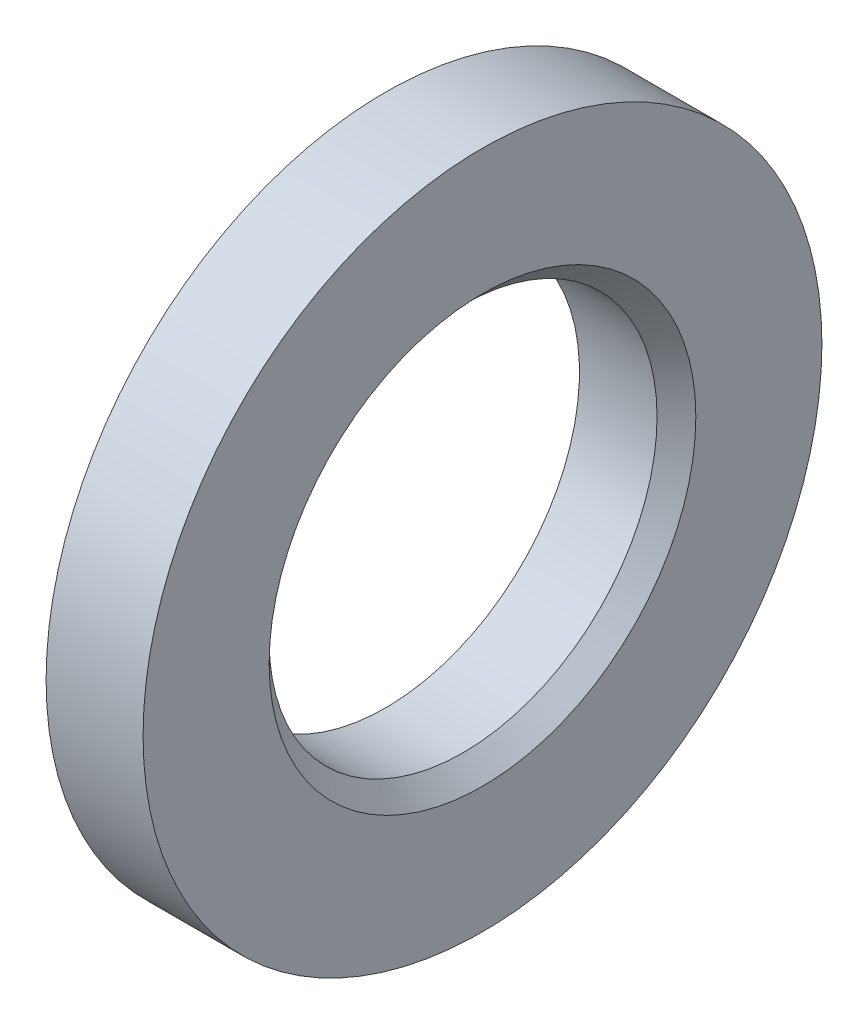
ISO-10303-21;
HEADER;
FILE_DESCRIPTION(('STEP AP214'),'2;1');
FILE_NAME('part.step','',(''),(''),'','','');
FILE_SCHEMA(('AUTOMOTIVE_DESIGN { 1 0 10303 214 1 1 1 1 }'));
ENDSEC;
DATA;
#1=APPLICATION_CONTEXT('core data for automotive mechanical design processes');
#2=APPLICATION_PROTOCOL_DEFINITION('international standard','automotive_design',2000,#1);
#3=PRODUCT_CONTEXT('',#1,'mechanical');
#4=PRODUCT('Part','Part','',(#3));
#5=PRODUCT_RELATED_PRODUCT_CATEGORY('part','',(#4));
#6=PRODUCT_DEFINITION_FORMATION('','',#4);
#7=PRODUCT_DEFINITION_CONTEXT('part definition',#1,'design');
#8=PRODUCT_DEFINITION('design','',#6,#7);
#9=PRODUCT_DEFINITION_SHAPE('','',#8);
#10=(LENGTH_UNIT() NAMED_UNIT(*) SI_UNIT(.MILLI.,.METRE.));
#11=(NAMED_UNIT(*) PLANE_ANGLE_UNIT() SI_UNIT($,.RADIAN.));
#12=(NAMED_UNIT(*) SI_UNIT($,.STERADIAN.) SOLID_ANGLE_UNIT());
#13=UNCERTAINTY_MEASURE_WITH_UNIT(LENGTH_MEASURE(1.E-05),#10,'distance_accuracy_value','');
#14=(GEOMETRIC_REPRESENTATION_CONTEXT(3) GLOBAL_UNCERTAINTY_ASSIGNED_CONTEXT((#13)) GLOBAL_UNIT_ASSIGNED_CONTEXT((#10,
#11,#12)) REPRESENTATION_CONTEXT('',''));
#15=CARTESIAN_POINT('',(0.,0.,0.));
#16=DIRECTION('',(0.,0.,1.));
#17=DIRECTION('',(1.,0.,0.));
#18=AXIS2_PLACEMENT_3D('',#15,#16,#17);
#19=CARTESIAN_POINT('',(8.8,-1.268,17.17164382766));
#20=DIRECTION('',(-1.,0.,0.));
#21=DIRECTION('',(0.,1.,0.));
#22=AXIS2_PLACEMENT_3D('',#19,#20,#21);
#23=PLANE('',#22);
#24=CARTESIAN_POINT('',(8.8,15.892,0.));
#25=DIRECTION('',(-1.,0.,0.));
#26=DIRECTION('',(0.,0.,1.));
#27=AXIS2_PLACEMENT_3D('',#24,#25,#26);
#28=CIRCLE('',#27,11.);
#29=CARTESIAN_POINT('',(8.8,15.892,11.));
#30=VERTEX_POINT('',#29);
#31=EDGE_CURVE('E19',#30,#30,#28,.F.);
#32=ORIENTED_EDGE('',*,*,#31,.T.);
#33=EDGE_LOOP('',(#32));
#34=FACE_BOUND('',#33,.T.);
#35=CARTESIAN_POINT('',(8.8,15.892,0.));
#36=DIRECTION('',(-1.,0.,0.));
#37=DIRECTION('',(0.,0.,1.));
#38=AXIS2_PLACEMENT_3D('',#35,#36,#37);
#39=CIRCLE('',#38,16.5);
#40=CARTESIAN_POINT('',(8.8,15.892,16.5));
#41=VERTEX_POINT('',#40);
#42=EDGE_CURVE('E44',#41,#41,#39,.F.);
#43=ORIENTED_EDGE('',*,*,#42,.F.);
#44=EDGE_LOOP('',(#43));
#45=FACE_BOUND('',#44,.T.);
#46=ADVANCED_FACE('F15',(#34,#45),#23,.T.);
#47=CARTESIAN_POINT('',(8.8,15.892,0.));
#48=DIRECTION('',(-1.,0.,0.));
#49=DIRECTION('',(0.,0.,1.));
#50=AXIS2_PLACEMENT_3D('',#47,#48,#49);
#51=CYLINDRICAL_SURFACE('',#50,11.);
#52=ORIENTED_EDGE('',*,*,#31,.F.);
#53=EDGE_LOOP('',(#52));
#54=FACE_BOUND('',#53,.T.);
#55=CARTESIAN_POINT('',(4.80000000000013,15.892,0.));
#56=DIRECTION('',(-1.,0.,0.));
#57=DIRECTION('',(0.,0.,1.));
#58=AXIS2_PLACEMENT_3D('',#55,#56,#57);
#59=CIRCLE('',#58,11.);
#60=CARTESIAN_POINT('',(4.80000000000013,15.892,11.));
#61=VERTEX_POINT('',#60);
#62=EDGE_CURVE('E42',#61,#61,#59,.T.);
#63=ORIENTED_EDGE('',*,*,#62,.F.);
#64=EDGE_LOOP('',(#63));
#65=FACE_BOUND('',#64,.T.);
#66=ADVANCED_FACE('F53',(#54,#65),#51,.T.);
#67=CARTESIAN_POINT('',(8.8,15.892,0.));
#68=DIRECTION('',(-1.,0.,0.));
#69=DIRECTION('',(0.,0.,1.));
#70=AXIS2_PLACEMENT_3D('',#67,#68,#69);
#71=CYLINDRICAL_SURFACE('',#70,16.5);
#72=ORIENTED_EDGE('',*,*,#42,.T.);
#73=EDGE_LOOP('',(#72));
#74=FACE_BOUND('',#73,.T.);
#75=CARTESIAN_POINT('',(4.80000000000013,15.892,0.));
#76=DIRECTION('',(-1.,0.,0.));
#77=DIRECTION('',(0.,0.,1.));
#78=AXIS2_PLACEMENT_3D('',#75,#76,#77);
#79=CIRCLE('',#78,16.5);
#80=CARTESIAN_POINT('',(4.80000000000013,15.892,16.5));
#81=VERTEX_POINT('',#80);
#82=EDGE_CURVE('E39',#81,#81,#79,.F.);
#83=ORIENTED_EDGE('',*,*,#82,.F.);
#84=EDGE_LOOP('',(#83));
#85=FACE_BOUND('',#84,.T.);
#86=ADVANCED_FACE('F56',(#74,#85),#71,.F.);
#87=CARTESIAN_POINT('',(4.8,-2.308,18.2));
#88=DIRECTION('',(-1.,0.,0.));
#89=DIRECTION('',(0.,1.,0.));
#90=AXIS2_PLACEMENT_3D('',#87,#88,#89);
#91=PLANE('',#90);
#92=CARTESIAN_POINT('',(4.8000000000003,15.892,0.));
#93=DIRECTION('',(-1.,0.,0.));
#94=DIRECTION('',(0.,0.,1.));
#95=AXIS2_PLACEMENT_3D('',#92,#93,#94);
#96=CIRCLE('',#95,10.);
#97=CARTESIAN_POINT('',(4.8000000000003,15.892,10.));
#98=VERTEX_POINT('',#97);
#99=EDGE_CURVE('E36',#98,#98,#96,.T.);
#100=ORIENTED_EDGE('',*,*,#99,.F.);
#101=EDGE_LOOP('',(#100));
#102=FACE_BOUND('',#101,.T.);
#103=ORIENTED_EDGE('',*,*,#62,.T.);
#104=EDGE_LOOP('',(#103));
#105=FACE_BOUND('',#104,.T.);
#106=ADVANCED_FACE('F60',(#102,#105),#91,.T.);
#107=CARTESIAN_POINT('',(4.8,-2.308,18.2));
#108=DIRECTION('',(-1.,0.,0.));
#109=DIRECTION('',(0.,1.,0.));
#110=AXIS2_PLACEMENT_3D('',#107,#108,#109);
#111=PLANE('',#110);
#112=ORIENTED_EDGE('',*,*,#82,.T.);
#113=EDGE_LOOP('',(#112));
#114=FACE_BOUND('',#113,.T.);
#115=CARTESIAN_POINT('',(4.80000000000016,15.892,0.));
#116=DIRECTION('',(-1.,0.,0.));
#117=DIRECTION('',(0.,0.,1.));
#118=AXIS2_PLACEMENT_3D('',#115,#116,#117);
#119=CIRCLE('',#118,17.5);
#120=CARTESIAN_POINT('',(4.80000000000016,15.892,17.5));
#121=VERTEX_POINT('',#120);
#122=EDGE_CURVE('E33',#121,#121,#119,.T.);
#123=ORIENTED_EDGE('',*,*,#122,.T.);
#124=EDGE_LOOP('',(#123));
#125=FACE_BOUND('',#124,.T.);
#126=ADVANCED_FACE('F62',(#114,#125),#111,.T.);
#127=CARTESIAN_POINT('',(8.82404708087621,15.892,0.));
#128=DIRECTION('',(-1.,0.,0.));
#129=DIRECTION('',(0.,0.,1.));
#130=AXIS2_PLACEMENT_3D('',#127,#128,#129);
#131=CYLINDRICAL_SURFACE('',#130,10.);
#132=ORIENTED_EDGE('',*,*,#99,.T.);
#133=EDGE_LOOP('',(#132));
#134=FACE_BOUND('',#133,.T.);
#135=CARTESIAN_POINT('',(8.79999353154213,15.892,0.));
#136=DIRECTION('',(1.,0.,0.));
#137=DIRECTION('',(0.,0.,-1.));
#138=AXIS2_PLACEMENT_3D('',#135,#136,#137);
#139=CIRCLE('',#138,10.);
#140=CARTESIAN_POINT('',(8.79999353154213,15.892,-10.));
#141=VERTEX_POINT('',#140);
#142=EDGE_CURVE('E28',#141,#141,#139,.F.);
#143=ORIENTED_EDGE('',*,*,#142,.F.);
#144=EDGE_LOOP('',(#143));
#145=FACE_BOUND('',#144,.T.);
#146=ADVANCED_FACE('F71',(#134,#145),#131,.F.);
#147=CARTESIAN_POINT('',(9.8,15.892,0.));
#148=DIRECTION('',(-1.,0.,0.));
#149=DIRECTION('',(0.,0.,1.));
#150=AXIS2_PLACEMENT_3D('',#147,#148,#149);
#151=CYLINDRICAL_SURFACE('',#150,17.5);
#152=ORIENTED_EDGE('',*,*,#122,.F.);
#153=EDGE_LOOP('',(#152));
#154=FACE_BOUND('',#153,.T.);
#155=CARTESIAN_POINT('',(9.8,15.892,0.));
#156=DIRECTION('',(-1.,0.,0.));
#157=DIRECTION('',(0.,0.,1.));
#158=AXIS2_PLACEMENT_3D('',#155,#156,#157);
#159=CIRCLE('',#158,17.5);
#160=CARTESIAN_POINT('',(9.8,15.892,17.5));
#161=VERTEX_POINT('',#160);
#162=EDGE_CURVE('E23',#161,#161,#159,.T.);
#163=ORIENTED_EDGE('',*,*,#162,.T.);
#164=EDGE_LOOP('',(#163));
#165=FACE_BOUND('',#164,.T.);
#166=ADVANCED_FACE('F83',(#154,#165),#151,.T.);
#167=CARTESIAN_POINT('',(8.79398435724895,15.892,0.));
#168=DIRECTION('',(1.,0.,0.));
#169=DIRECTION('',(0.,0.,-1.));
#170=AXIS2_PLACEMENT_3D('',#167,#168,#169);
#171=CONICAL_SURFACE('',#170,9.99399082181982,0.785398486819829);
#172=ORIENTED_EDGE('',*,*,#142,.T.);
#173=EDGE_LOOP('',(#172));
#174=FACE_BOUND('',#173,.T.);
#175=CARTESIAN_POINT('',(9.8,15.892,0.));
#176=DIRECTION('',(-1.,0.,0.));
#177=DIRECTION('',(0.,0.,1.));
#178=AXIS2_PLACEMENT_3D('',#175,#176,#177);
#179=CIRCLE('',#178,11.000007115307);
#180=CARTESIAN_POINT('',(9.8,15.892,11.000007115307));
#181=VERTEX_POINT('',#180);
#182=EDGE_CURVE('E10',#181,#181,#179,.F.);
#183=ORIENTED_EDGE('',*,*,#182,.T.);
#184=EDGE_LOOP('',(#183));
#185=FACE_BOUND('',#184,.T.);
#186=ADVANCED_FACE('F77',(#174,#185),#171,.F.);
#187=CARTESIAN_POINT('',(9.8,-2.308,18.2));
#188=DIRECTION('',(-1.,0.,0.));
#189=DIRECTION('',(0.,1.,0.));
#190=AXIS2_PLACEMENT_3D('',#187,#188,#189);
#191=PLANE('',#190);
#192=ORIENTED_EDGE('',*,*,#182,.F.);
#193=EDGE_LOOP('',(#192));
#194=FACE_BOUND('',#193,.T.);
#195=ORIENTED_EDGE('',*,*,#162,.F.);
#196=EDGE_LOOP('',(#195));
#197=FACE_BOUND('',#196,.T.);
#198=ADVANCED_FACE('F17',(#194,#197),#191,.F.);
#199=CLOSED_SHELL('',(#46,#66,#86,#106,#126,#146,#166,#186,#198));
#200=MANIFOLD_SOLID_BREP('B1',#199);
#201=ADVANCED_BREP_SHAPE_REPRESENTATION('',(#18,#200),#14);
#202=SHAPE_DEFINITION_REPRESENTATION(#9,#201);
ENDSEC;
END-ISO-10303-21;
